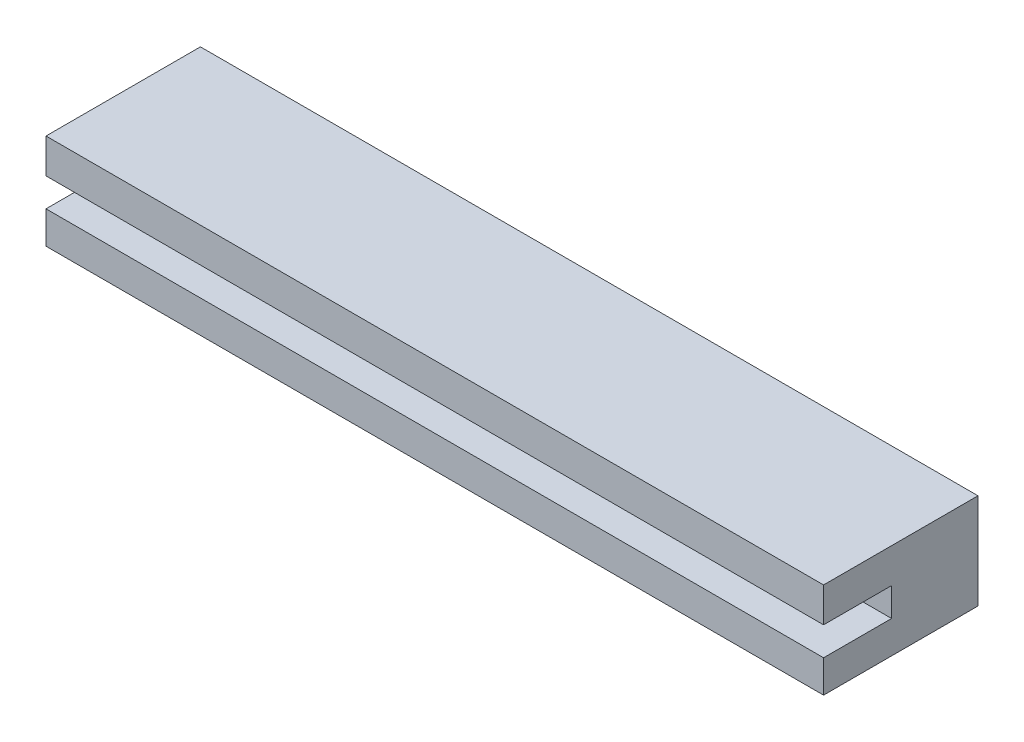
ISO-10303-21;
HEADER;
FILE_DESCRIPTION(('STEP AP214'),'2;1');
FILE_NAME('part.step','',(''),(''),'','','');
FILE_SCHEMA(('AUTOMOTIVE_DESIGN { 1 0 10303 214 1 1 1 1 }'));
ENDSEC;
DATA;
#1=APPLICATION_CONTEXT('core data for automotive mechanical design processes');
#2=APPLICATION_PROTOCOL_DEFINITION('international standard','automotive_design',2000,#1);
#3=PRODUCT_CONTEXT('',#1,'mechanical');
#4=PRODUCT('Part','Part','',(#3));
#5=PRODUCT_RELATED_PRODUCT_CATEGORY('part','',(#4));
#6=PRODUCT_DEFINITION_FORMATION('','',#4);
#7=PRODUCT_DEFINITION_CONTEXT('part definition',#1,'design');
#8=PRODUCT_DEFINITION('design','',#6,#7);
#9=PRODUCT_DEFINITION_SHAPE('','',#8);
#10=(LENGTH_UNIT() NAMED_UNIT(*) SI_UNIT(.MILLI.,.METRE.));
#11=(NAMED_UNIT(*) PLANE_ANGLE_UNIT() SI_UNIT($,.RADIAN.));
#12=(NAMED_UNIT(*) SI_UNIT($,.STERADIAN.) SOLID_ANGLE_UNIT());
#13=UNCERTAINTY_MEASURE_WITH_UNIT(LENGTH_MEASURE(1.E-05),#10,'distance_accuracy_value','');
#14=(GEOMETRIC_REPRESENTATION_CONTEXT(3) GLOBAL_UNCERTAINTY_ASSIGNED_CONTEXT((#13)) GLOBAL_UNIT_ASSIGNED_CONTEXT((#10,
#11,#12)) REPRESENTATION_CONTEXT('',''));
#15=CARTESIAN_POINT('',(0.,0.,0.));
#16=DIRECTION('',(0.,0.,1.));
#17=DIRECTION('',(1.,0.,0.));
#18=AXIS2_PLACEMENT_3D('',#15,#16,#17);
#19=CARTESIAN_POINT('',(45.72,0.,0.));
#20=DIRECTION('',(0.,0.,-1.));
#21=DIRECTION('',(0.,1.,0.));
#22=AXIS2_PLACEMENT_3D('',#19,#20,#21);
#23=PLANE('',#22);
#24=DIRECTION('',(0.,-1.,0.));
#25=VECTOR('',#24,1.);
#26=CARTESIAN_POINT('',(0.,0.,0.));
#27=LINE('',#26,#25);
#28=CARTESIAN_POINT('',(0.,0.,0.));
#29=VERTEX_POINT('',#28);
#30=CARTESIAN_POINT('',(0.,-2.032,0.));
#31=VERTEX_POINT('',#30);
#32=EDGE_CURVE('E133',#29,#31,#27,.T.);
#33=ORIENTED_EDGE('',*,*,#32,.T.);
#34=DIRECTION('',(-1.,0.,0.));
#35=VECTOR('',#34,1.);
#36=CARTESIAN_POINT('',(45.72,-2.032,0.));
#37=LINE('',#36,#35);
#38=CARTESIAN_POINT('',(45.72,-2.032,0.));
#39=VERTEX_POINT('',#38);
#40=EDGE_CURVE('E11',#39,#31,#37,.T.);
#41=ORIENTED_EDGE('',*,*,#40,.F.);
#42=DIRECTION('',(0.,-1.,0.));
#43=VECTOR('',#42,1.);
#44=CARTESIAN_POINT('',(45.72,0.,0.));
#45=LINE('',#44,#43);
#46=CARTESIAN_POINT('',(45.72,0.,0.));
#47=VERTEX_POINT('',#46);
#48=EDGE_CURVE('E151',#47,#39,#45,.T.);
#49=ORIENTED_EDGE('',*,*,#48,.F.);
#50=DIRECTION('',(-1.,0.,0.));
#51=VECTOR('',#50,1.);
#52=CARTESIAN_POINT('',(45.72,0.,0.));
#53=LINE('',#52,#51);
#54=EDGE_CURVE('E51',#47,#29,#53,.T.);
#55=ORIENTED_EDGE('',*,*,#54,.T.);
#56=EDGE_LOOP('',(#33,#41,#49,#55));
#57=FACE_BOUND('',#56,.T.);
#58=ADVANCED_FACE('F35',(#57),#23,.F.);
#59=CARTESIAN_POINT('',(45.72,-2.032,0.));
#60=DIRECTION('',(0.,1.,0.));
#61=DIRECTION('',(0.,0.,1.));
#62=AXIS2_PLACEMENT_3D('',#59,#60,#61);
#63=PLANE('',#62);
#64=DIRECTION('',(0.,0.,-1.));
#65=VECTOR('',#64,1.);
#66=CARTESIAN_POINT('',(0.,-2.032,0.));
#67=LINE('',#66,#65);
#68=CARTESIAN_POINT('',(0.,-2.032,-4.));
#69=VERTEX_POINT('',#68);
#70=EDGE_CURVE('E135',#31,#69,#67,.T.);
#71=ORIENTED_EDGE('',*,*,#70,.T.);
#72=DIRECTION('',(-1.,0.,0.));
#73=VECTOR('',#72,1.);
#74=CARTESIAN_POINT('',(45.72,-2.032,-4.));
#75=LINE('',#74,#73);
#76=CARTESIAN_POINT('',(45.72,-2.032,-4.));
#77=VERTEX_POINT('',#76);
#78=EDGE_CURVE('E43',#77,#69,#75,.T.);
#79=ORIENTED_EDGE('',*,*,#78,.F.);
#80=DIRECTION('',(0.,0.,-1.));
#81=VECTOR('',#80,1.);
#82=CARTESIAN_POINT('',(45.72,-2.032,0.));
#83=LINE('',#82,#81);
#84=EDGE_CURVE('E90',#39,#77,#83,.T.);
#85=ORIENTED_EDGE('',*,*,#84,.F.);
#86=ORIENTED_EDGE('',*,*,#40,.T.);
#87=EDGE_LOOP('',(#71,#79,#85,#86));
#88=FACE_BOUND('',#87,.T.);
#89=ADVANCED_FACE('F178',(#88),#63,.F.);
#90=CARTESIAN_POINT('',(45.72,0.,-4.));
#91=DIRECTION('',(0.,0.,-1.));
#92=DIRECTION('',(-1.,0.,0.));
#93=AXIS2_PLACEMENT_3D('',#90,#91,#92);
#94=PLANE('',#93);
#95=DIRECTION('',(0.,-1.,0.));
#96=VECTOR('',#95,1.);
#97=CARTESIAN_POINT('',(0.,0.,-4.));
#98=LINE('',#97,#96);
#99=CARTESIAN_POINT('',(0.,-3.7084,-4.));
#100=VERTEX_POINT('',#99);
#101=EDGE_CURVE('E137',#69,#100,#98,.T.);
#102=ORIENTED_EDGE('',*,*,#101,.T.);
#103=DIRECTION('',(-1.,0.,0.));
#104=VECTOR('',#103,1.);
#105=CARTESIAN_POINT('',(45.72,-3.7084,-4.));
#106=LINE('',#105,#104);
#107=CARTESIAN_POINT('',(45.72,-3.7084,-4.));
#108=VERTEX_POINT('',#107);
#109=EDGE_CURVE('E157',#108,#100,#106,.T.);
#110=ORIENTED_EDGE('',*,*,#109,.F.);
#111=DIRECTION('',(0.,-1.,0.));
#112=VECTOR('',#111,1.);
#113=CARTESIAN_POINT('',(45.72,0.,-4.));
#114=LINE('',#113,#112);
#115=EDGE_CURVE('E164',#77,#108,#114,.T.);
#116=ORIENTED_EDGE('',*,*,#115,.F.);
#117=ORIENTED_EDGE('',*,*,#78,.T.);
#118=EDGE_LOOP('',(#102,#110,#116,#117));
#119=FACE_BOUND('',#118,.T.);
#120=ADVANCED_FACE('F162',(#119),#94,.F.);
#121=CARTESIAN_POINT('',(45.72,-3.7084,0.));
#122=DIRECTION('',(0.,1.,0.));
#123=DIRECTION('',(0.,0.,1.));
#124=AXIS2_PLACEMENT_3D('',#121,#122,#123);
#125=PLANE('',#124);
#126=DIRECTION('',(0.,0.,-1.));
#127=VECTOR('',#126,1.);
#128=CARTESIAN_POINT('',(0.,-3.7084,0.));
#129=LINE('',#128,#127);
#130=CARTESIAN_POINT('',(0.,-3.7084,0.));
#131=VERTEX_POINT('',#130);
#132=EDGE_CURVE('E140',#131,#100,#129,.T.);
#133=ORIENTED_EDGE('',*,*,#132,.F.);
#134=DIRECTION('',(-1.,0.,0.));
#135=VECTOR('',#134,1.);
#136=CARTESIAN_POINT('',(45.72,-3.7084,0.));
#137=LINE('',#136,#135);
#138=CARTESIAN_POINT('',(45.72,-3.7084,0.));
#139=VERTEX_POINT('',#138);
#140=EDGE_CURVE('E155',#139,#131,#137,.T.);
#141=ORIENTED_EDGE('',*,*,#140,.F.);
#142=DIRECTION('',(0.,0.,-1.));
#143=VECTOR('',#142,1.);
#144=CARTESIAN_POINT('',(45.72,-3.7084,0.));
#145=LINE('',#144,#143);
#146=EDGE_CURVE('E172',#139,#108,#145,.T.);
#147=ORIENTED_EDGE('',*,*,#146,.T.);
#148=ORIENTED_EDGE('',*,*,#109,.T.);
#149=EDGE_LOOP('',(#133,#141,#147,#148));
#150=FACE_BOUND('',#149,.T.);
#151=ADVANCED_FACE('F170',(#150),#125,.T.);
#152=CARTESIAN_POINT('',(45.72,0.,0.));
#153=DIRECTION('',(0.,0.,-1.));
#154=DIRECTION('',(0.,1.,0.));
#155=AXIS2_PLACEMENT_3D('',#152,#153,#154);
#156=PLANE('',#155);
#157=DIRECTION('',(0.,-1.,0.));
#158=VECTOR('',#157,1.);
#159=CARTESIAN_POINT('',(0.,0.,0.));
#160=LINE('',#159,#158);
#161=CARTESIAN_POINT('',(0.,-5.6134,0.));
#162=VERTEX_POINT('',#161);
#163=EDGE_CURVE('E143',#131,#162,#160,.T.);
#164=ORIENTED_EDGE('',*,*,#163,.T.);
#165=DIRECTION('',(-1.,0.,0.));
#166=VECTOR('',#165,1.);
#167=CARTESIAN_POINT('',(45.72,-5.6134,0.));
#168=LINE('',#167,#166);
#169=CARTESIAN_POINT('',(45.72,-5.6134,0.));
#170=VERTEX_POINT('',#169);
#171=EDGE_CURVE('E125',#170,#162,#168,.T.);
#172=ORIENTED_EDGE('',*,*,#171,.F.);
#173=DIRECTION('',(0.,-1.,0.));
#174=VECTOR('',#173,1.);
#175=CARTESIAN_POINT('',(45.72,0.,0.));
#176=LINE('',#175,#174);
#177=EDGE_CURVE('E113',#139,#170,#176,.T.);
#178=ORIENTED_EDGE('',*,*,#177,.F.);
#179=ORIENTED_EDGE('',*,*,#140,.T.);
#180=EDGE_LOOP('',(#164,#172,#178,#179));
#181=FACE_BOUND('',#180,.T.);
#182=ADVANCED_FACE('F188',(#181),#156,.F.);
#183=CARTESIAN_POINT('',(45.72,-5.6134,0.));
#184=DIRECTION('',(0.,1.,0.));
#185=DIRECTION('',(0.,0.,1.));
#186=AXIS2_PLACEMENT_3D('',#183,#184,#185);
#187=PLANE('',#186);
#188=DIRECTION('',(0.,0.,-1.));
#189=VECTOR('',#188,1.);
#190=CARTESIAN_POINT('',(0.,-5.6134,0.));
#191=LINE('',#190,#189);
#192=CARTESIAN_POINT('',(0.,-5.6134,-9.08));
#193=VERTEX_POINT('',#192);
#194=EDGE_CURVE('E122',#162,#193,#191,.T.);
#195=ORIENTED_EDGE('',*,*,#194,.T.);
#196=DIRECTION('',(-1.,0.,0.));
#197=VECTOR('',#196,1.);
#198=CARTESIAN_POINT('',(45.72,-5.6134,-9.08));
#199=LINE('',#198,#197);
#200=CARTESIAN_POINT('',(45.72,-5.6134,-9.08));
#201=VERTEX_POINT('',#200);
#202=EDGE_CURVE('E119',#201,#193,#199,.T.);
#203=ORIENTED_EDGE('',*,*,#202,.F.);
#204=DIRECTION('',(0.,0.,-1.));
#205=VECTOR('',#204,1.);
#206=CARTESIAN_POINT('',(45.72,-5.6134,0.));
#207=LINE('',#206,#205);
#208=EDGE_CURVE('E105',#170,#201,#207,.T.);
#209=ORIENTED_EDGE('',*,*,#208,.F.);
#210=ORIENTED_EDGE('',*,*,#171,.T.);
#211=EDGE_LOOP('',(#195,#203,#209,#210));
#212=FACE_BOUND('',#211,.T.);
#213=ADVANCED_FACE('F120',(#212),#187,.F.);
#214=CARTESIAN_POINT('',(45.72,0.,-9.08));
#215=DIRECTION('',(0.,0.,1.));
#216=DIRECTION('',(1.,0.,0.));
#217=AXIS2_PLACEMENT_3D('',#214,#215,#216);
#218=PLANE('',#217);
#219=DIRECTION('',(0.,1.,0.));
#220=VECTOR('',#219,1.);
#221=CARTESIAN_POINT('',(0.,0.,-9.08));
#222=LINE('',#221,#220);
#223=CARTESIAN_POINT('',(0.,0.,-9.08));
#224=VERTEX_POINT('',#223);
#225=EDGE_CURVE('E146',#193,#224,#222,.T.);
#226=ORIENTED_EDGE('',*,*,#225,.T.);
#227=DIRECTION('',(-1.,0.,0.));
#228=VECTOR('',#227,1.);
#229=CARTESIAN_POINT('',(45.72,0.,-9.08));
#230=LINE('',#229,#228);
#231=CARTESIAN_POINT('',(45.72,0.,-9.08));
#232=VERTEX_POINT('',#231);
#233=EDGE_CURVE('E78',#232,#224,#230,.T.);
#234=ORIENTED_EDGE('',*,*,#233,.F.);
#235=DIRECTION('',(0.,1.,0.));
#236=VECTOR('',#235,1.);
#237=CARTESIAN_POINT('',(45.72,0.,-9.08));
#238=LINE('',#237,#236);
#239=EDGE_CURVE('E110',#201,#232,#238,.T.);
#240=ORIENTED_EDGE('',*,*,#239,.F.);
#241=ORIENTED_EDGE('',*,*,#202,.T.);
#242=EDGE_LOOP('',(#226,#234,#240,#241));
#243=FACE_BOUND('',#242,.T.);
#244=ADVANCED_FACE('F127',(#243),#218,.F.);
#245=CARTESIAN_POINT('',(45.72,0.,0.));
#246=DIRECTION('',(0.,1.,0.));
#247=DIRECTION('',(0.,0.,1.));
#248=AXIS2_PLACEMENT_3D('',#245,#246,#247);
#249=PLANE('',#248);
#250=DIRECTION('',(0.,0.,-1.));
#251=VECTOR('',#250,1.);
#252=CARTESIAN_POINT('',(0.,0.,0.));
#253=LINE('',#252,#251);
#254=EDGE_CURVE('E148',#29,#224,#253,.T.);
#255=ORIENTED_EDGE('',*,*,#254,.F.);
#256=ORIENTED_EDGE('',*,*,#54,.F.);
#257=DIRECTION('',(0.,0.,-1.));
#258=VECTOR('',#257,1.);
#259=CARTESIAN_POINT('',(45.72,0.,0.));
#260=LINE('',#259,#258);
#261=EDGE_CURVE('E128',#47,#232,#260,.T.);
#262=ORIENTED_EDGE('',*,*,#261,.T.);
#263=ORIENTED_EDGE('',*,*,#233,.T.);
#264=EDGE_LOOP('',(#255,#256,#262,#263));
#265=FACE_BOUND('',#264,.T.);
#266=ADVANCED_FACE('F196',(#265),#249,.T.);
#267=CARTESIAN_POINT('',(45.72,0.,0.));
#268=DIRECTION('',(1.,0.,0.));
#269=DIRECTION('',(0.,0.,-1.));
#270=AXIS2_PLACEMENT_3D('',#267,#268,#269);
#271=PLANE('',#270);
#272=ORIENTED_EDGE('',*,*,#48,.T.);
#273=ORIENTED_EDGE('',*,*,#84,.T.);
#274=ORIENTED_EDGE('',*,*,#115,.T.);
#275=ORIENTED_EDGE('',*,*,#146,.F.);
#276=ORIENTED_EDGE('',*,*,#177,.T.);
#277=ORIENTED_EDGE('',*,*,#208,.T.);
#278=ORIENTED_EDGE('',*,*,#239,.T.);
#279=ORIENTED_EDGE('',*,*,#261,.F.);
#280=EDGE_LOOP('',(#272,#273,#274,#275,#276,#277,#278,#279));
#281=FACE_BOUND('',#280,.T.);
#282=ADVANCED_FACE('F107',(#281),#271,.T.);
#283=CARTESIAN_POINT('',(0.,0.,0.));
#284=DIRECTION('',(1.,0.,0.));
#285=DIRECTION('',(0.,0.,-1.));
#286=AXIS2_PLACEMENT_3D('',#283,#284,#285);
#287=PLANE('',#286);
#288=ORIENTED_EDGE('',*,*,#32,.F.);
#289=ORIENTED_EDGE('',*,*,#254,.T.);
#290=ORIENTED_EDGE('',*,*,#225,.F.);
#291=ORIENTED_EDGE('',*,*,#194,.F.);
#292=ORIENTED_EDGE('',*,*,#163,.F.);
#293=ORIENTED_EDGE('',*,*,#132,.T.);
#294=ORIENTED_EDGE('',*,*,#101,.F.);
#295=ORIENTED_EDGE('',*,*,#70,.F.);
#296=EDGE_LOOP('',(#288,#289,#290,#291,#292,#293,#294,#295));
#297=FACE_BOUND('',#296,.T.);
#298=ADVANCED_FACE('F166',(#297),#287,.F.);
#299=CLOSED_SHELL('',(#58,#89,#120,#151,#182,#213,#244,#266,#282,#298));
#300=MANIFOLD_SOLID_BREP('B2',#299);
#301=ADVANCED_BREP_SHAPE_REPRESENTATION('',(#18,#300),#14);
#302=SHAPE_DEFINITION_REPRESENTATION(#9,#301);
ENDSEC;
END-ISO-10303-21;
